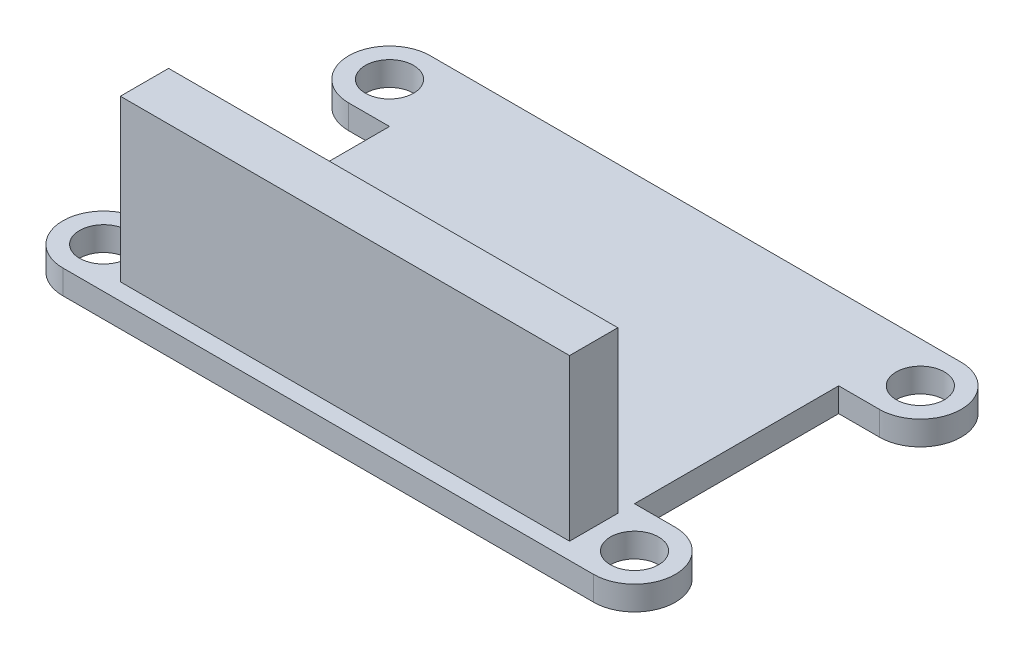
ISO-10303-21;
HEADER;
FILE_DESCRIPTION(('STEP AP214'),'2;1');
FILE_NAME('part.step','',(''),(''),'','','');
FILE_SCHEMA(('AUTOMOTIVE_DESIGN { 1 0 10303 214 1 1 1 1 }'));
ENDSEC;
DATA;
#1=APPLICATION_CONTEXT('core data for automotive mechanical design processes');
#2=APPLICATION_PROTOCOL_DEFINITION('international standard','automotive_design',2000,#1);
#3=PRODUCT_CONTEXT('',#1,'mechanical');
#4=PRODUCT('Part','Part','',(#3));
#5=PRODUCT_RELATED_PRODUCT_CATEGORY('part','',(#4));
#6=PRODUCT_DEFINITION_FORMATION('','',#4);
#7=PRODUCT_DEFINITION_CONTEXT('part definition',#1,'design');
#8=PRODUCT_DEFINITION('design','',#6,#7);
#9=PRODUCT_DEFINITION_SHAPE('','',#8);
#10=(LENGTH_UNIT() NAMED_UNIT(*) SI_UNIT(.MILLI.,.METRE.));
#11=(NAMED_UNIT(*) PLANE_ANGLE_UNIT() SI_UNIT($,.RADIAN.));
#12=(NAMED_UNIT(*) SI_UNIT($,.STERADIAN.) SOLID_ANGLE_UNIT());
#13=UNCERTAINTY_MEASURE_WITH_UNIT(LENGTH_MEASURE(1.E-05),#10,'distance_accuracy_value','');
#14=(GEOMETRIC_REPRESENTATION_CONTEXT(3) GLOBAL_UNCERTAINTY_ASSIGNED_CONTEXT((#13)) GLOBAL_UNIT_ASSIGNED_CONTEXT((#10,
#11,#12)) REPRESENTATION_CONTEXT('',''));
#15=CARTESIAN_POINT('',(0.,0.,0.));
#16=DIRECTION('',(0.,0.,1.));
#17=DIRECTION('',(1.,0.,0.));
#18=AXIS2_PLACEMENT_3D('',#15,#16,#17);
#19=CARTESIAN_POINT('',(35.56,1.5,-20.32));
#20=DIRECTION('',(0.,-1.,0.));
#21=DIRECTION('',(0.,0.,-1.));
#22=AXIS2_PLACEMENT_3D('',#19,#20,#21);
#23=CYLINDRICAL_SURFACE('',#22,2.53999999999999);
#24=CARTESIAN_POINT('',(35.56,0.,-20.32));
#25=DIRECTION('',(0.,1.,0.));
#26=DIRECTION('',(0.,0.,1.));
#27=AXIS2_PLACEMENT_3D('',#24,#25,#26);
#28=CIRCLE('',#27,2.53999999999999);
#29=CARTESIAN_POINT('',(35.56,0.,-22.86));
#30=VERTEX_POINT('',#29);
#31=CARTESIAN_POINT('',(35.56,0.,-17.78));
#32=VERTEX_POINT('',#31);
#33=EDGE_CURVE('E180',#30,#32,#28,.F.);
#34=ORIENTED_EDGE('',*,*,#33,.F.);
#35=DIRECTION('',(0.,-1.,0.));
#36=VECTOR('',#35,1.);
#37=CARTESIAN_POINT('',(35.56,1.5,-22.86));
#38=LINE('',#37,#36);
#39=CARTESIAN_POINT('',(35.56,1.5,-22.86));
#40=VERTEX_POINT('',#39);
#41=EDGE_CURVE('E11',#40,#30,#38,.T.);
#42=ORIENTED_EDGE('',*,*,#41,.F.);
#43=CARTESIAN_POINT('',(35.56,1.5,-20.32));
#44=DIRECTION('',(0.,1.,0.));
#45=DIRECTION('',(0.,0.,1.));
#46=AXIS2_PLACEMENT_3D('',#43,#44,#45);
#47=CIRCLE('',#46,2.53999999999999);
#48=CARTESIAN_POINT('',(35.56,1.5,-17.78));
#49=VERTEX_POINT('',#48);
#50=EDGE_CURVE('E378',#40,#49,#47,.F.);
#51=ORIENTED_EDGE('',*,*,#50,.T.);
#52=DIRECTION('',(0.,-1.,0.));
#53=VECTOR('',#52,1.);
#54=CARTESIAN_POINT('',(35.56,1.5,-17.78));
#55=LINE('',#54,#53);
#56=EDGE_CURVE('E60',#49,#32,#55,.T.);
#57=ORIENTED_EDGE('',*,*,#56,.T.);
#58=EDGE_LOOP('',(#34,#42,#51,#57));
#59=FACE_BOUND('',#58,.T.);
#60=ADVANCED_FACE('F36',(#59),#23,.T.);
#61=CARTESIAN_POINT('',(0.,1.5,-22.86));
#62=DIRECTION('',(0.,0.,1.));
#63=DIRECTION('',(1.,0.,0.));
#64=AXIS2_PLACEMENT_3D('',#61,#62,#63);
#65=PLANE('',#64);
#66=DIRECTION('',(-1.,0.,0.));
#67=VECTOR('',#66,1.);
#68=CARTESIAN_POINT('',(0.,0.,-22.86));
#69=LINE('',#68,#67);
#70=CARTESIAN_POINT('',(2.54000000000001,0.,-22.86));
#71=VERTEX_POINT('',#70);
#72=EDGE_CURVE('E183',#30,#71,#69,.T.);
#73=ORIENTED_EDGE('',*,*,#72,.T.);
#74=DIRECTION('',(0.,-1.,0.));
#75=VECTOR('',#74,1.);
#76=CARTESIAN_POINT('',(2.54000000000001,1.5,-22.86));
#77=LINE('',#76,#75);
#78=CARTESIAN_POINT('',(2.54000000000001,1.5,-22.86));
#79=VERTEX_POINT('',#78);
#80=EDGE_CURVE('E44',#79,#71,#77,.T.);
#81=ORIENTED_EDGE('',*,*,#80,.F.);
#82=DIRECTION('',(-1.,0.,0.));
#83=VECTOR('',#82,1.);
#84=CARTESIAN_POINT('',(0.,1.5,-22.86));
#85=LINE('',#84,#83);
#86=EDGE_CURVE('E380',#40,#79,#85,.T.);
#87=ORIENTED_EDGE('',*,*,#86,.F.);
#88=ORIENTED_EDGE('',*,*,#41,.T.);
#89=EDGE_LOOP('',(#73,#81,#87,#88));
#90=FACE_BOUND('',#89,.T.);
#91=ADVANCED_FACE('F250',(#90),#65,.F.);
#92=CARTESIAN_POINT('',(2.54000000000001,1.5,-20.32));
#93=DIRECTION('',(0.,-1.,0.));
#94=DIRECTION('',(0.,0.,-1.));
#95=AXIS2_PLACEMENT_3D('',#92,#93,#94);
#96=CYLINDRICAL_SURFACE('',#95,2.53999999999999);
#97=CARTESIAN_POINT('',(2.54000000000001,0.,-20.32));
#98=DIRECTION('',(0.,1.,0.));
#99=DIRECTION('',(0.,0.,1.));
#100=AXIS2_PLACEMENT_3D('',#97,#98,#99);
#101=CIRCLE('',#100,2.53999999999999);
#102=CARTESIAN_POINT('',(2.54000000000001,0.,-17.78));
#103=VERTEX_POINT('',#102);
#104=EDGE_CURVE('E186',#71,#103,#101,.T.);
#105=ORIENTED_EDGE('',*,*,#104,.T.);
#106=DIRECTION('',(0.,-1.,0.));
#107=VECTOR('',#106,1.);
#108=CARTESIAN_POINT('',(2.54000000000001,1.5,-17.78));
#109=LINE('',#108,#107);
#110=CARTESIAN_POINT('',(2.54000000000001,1.5,-17.78));
#111=VERTEX_POINT('',#110);
#112=EDGE_CURVE('E238',#111,#103,#109,.T.);
#113=ORIENTED_EDGE('',*,*,#112,.F.);
#114=CARTESIAN_POINT('',(2.54000000000001,1.5,-20.32));
#115=DIRECTION('',(0.,1.,0.));
#116=DIRECTION('',(0.,0.,1.));
#117=AXIS2_PLACEMENT_3D('',#114,#115,#116);
#118=CIRCLE('',#117,2.53999999999999);
#119=EDGE_CURVE('E246',#79,#111,#118,.T.);
#120=ORIENTED_EDGE('',*,*,#119,.F.);
#121=ORIENTED_EDGE('',*,*,#80,.T.);
#122=EDGE_LOOP('',(#105,#113,#120,#121));
#123=FACE_BOUND('',#122,.T.);
#124=ADVANCED_FACE('F243',(#123),#96,.T.);
#125=CARTESIAN_POINT('',(0.,1.5,-17.78));
#126=DIRECTION('',(0.,0.,-1.));
#127=DIRECTION('',(-1.,0.,0.));
#128=AXIS2_PLACEMENT_3D('',#125,#126,#127);
#129=PLANE('',#128);
#130=DIRECTION('',(1.,0.,0.));
#131=VECTOR('',#130,1.);
#132=CARTESIAN_POINT('',(0.,0.,-17.78));
#133=LINE('',#132,#131);
#134=CARTESIAN_POINT('',(5.08,0.,-17.78));
#135=VERTEX_POINT('',#134);
#136=EDGE_CURVE('E189',#103,#135,#133,.T.);
#137=ORIENTED_EDGE('',*,*,#136,.T.);
#138=DIRECTION('',(0.,-1.,0.));
#139=VECTOR('',#138,1.);
#140=CARTESIAN_POINT('',(5.08,1.5,-17.78));
#141=LINE('',#140,#139);
#142=CARTESIAN_POINT('',(5.08,1.5,-17.78));
#143=VERTEX_POINT('',#142);
#144=EDGE_CURVE('E235',#143,#135,#141,.T.);
#145=ORIENTED_EDGE('',*,*,#144,.F.);
#146=DIRECTION('',(1.,0.,0.));
#147=VECTOR('',#146,1.);
#148=CARTESIAN_POINT('',(0.,1.5,-17.78));
#149=LINE('',#148,#147);
#150=EDGE_CURVE('E383',#111,#143,#149,.T.);
#151=ORIENTED_EDGE('',*,*,#150,.F.);
#152=ORIENTED_EDGE('',*,*,#112,.T.);
#153=EDGE_LOOP('',(#137,#145,#151,#152));
#154=FACE_BOUND('',#153,.T.);
#155=ADVANCED_FACE('F262',(#154),#129,.F.);
#156=CARTESIAN_POINT('',(5.08000000000001,1.5,0.));
#157=DIRECTION('',(1.,0.,0.));
#158=DIRECTION('',(0.,0.,-1.));
#159=AXIS2_PLACEMENT_3D('',#156,#157,#158);
#160=PLANE('',#159);
#161=DIRECTION('',(0.,0.,1.));
#162=VECTOR('',#161,1.);
#163=CARTESIAN_POINT('',(5.08000000000001,0.,0.));
#164=LINE('',#163,#162);
#165=CARTESIAN_POINT('',(5.08000000000001,0.,-5.08));
#166=VERTEX_POINT('',#165);
#167=EDGE_CURVE('E192',#135,#166,#164,.T.);
#168=ORIENTED_EDGE('',*,*,#167,.T.);
#169=DIRECTION('',(0.,-1.,0.));
#170=VECTOR('',#169,1.);
#171=CARTESIAN_POINT('',(5.08000000000001,1.5,-5.08));
#172=LINE('',#171,#170);
#173=CARTESIAN_POINT('',(5.08000000000001,1.5,-5.08));
#174=VERTEX_POINT('',#173);
#175=EDGE_CURVE('E233',#174,#166,#172,.T.);
#176=ORIENTED_EDGE('',*,*,#175,.F.);
#177=DIRECTION('',(0.,0.,1.));
#178=VECTOR('',#177,1.);
#179=CARTESIAN_POINT('',(5.08000000000001,1.5,0.));
#180=LINE('',#179,#178);
#181=EDGE_CURVE('E386',#143,#174,#180,.T.);
#182=ORIENTED_EDGE('',*,*,#181,.F.);
#183=ORIENTED_EDGE('',*,*,#144,.T.);
#184=EDGE_LOOP('',(#168,#176,#182,#183));
#185=FACE_BOUND('',#184,.T.);
#186=ADVANCED_FACE('F265',(#185),#160,.F.);
#187=CARTESIAN_POINT('',(0.,1.5,-5.08));
#188=DIRECTION('',(0.,0.,-1.));
#189=DIRECTION('',(-1.,0.,0.));
#190=AXIS2_PLACEMENT_3D('',#187,#188,#189);
#191=PLANE('',#190);
#192=DIRECTION('',(1.,0.,0.));
#193=VECTOR('',#192,1.);
#194=CARTESIAN_POINT('',(0.,0.,-5.08));
#195=LINE('',#194,#193);
#196=CARTESIAN_POINT('',(2.54000000000001,0.,-5.08));
#197=VERTEX_POINT('',#196);
#198=EDGE_CURVE('E195',#197,#166,#195,.T.);
#199=ORIENTED_EDGE('',*,*,#198,.F.);
#200=DIRECTION('',(0.,-1.,0.));
#201=VECTOR('',#200,1.);
#202=CARTESIAN_POINT('',(2.54000000000001,1.5,-5.08));
#203=LINE('',#202,#201);
#204=CARTESIAN_POINT('',(2.54000000000001,1.5,-5.08));
#205=VERTEX_POINT('',#204);
#206=EDGE_CURVE('E231',#205,#197,#203,.T.);
#207=ORIENTED_EDGE('',*,*,#206,.F.);
#208=DIRECTION('',(1.,0.,0.));
#209=VECTOR('',#208,1.);
#210=CARTESIAN_POINT('',(0.,1.5,-5.08));
#211=LINE('',#210,#209);
#212=EDGE_CURVE('E388',#205,#174,#211,.T.);
#213=ORIENTED_EDGE('',*,*,#212,.T.);
#214=ORIENTED_EDGE('',*,*,#175,.T.);
#215=EDGE_LOOP('',(#199,#207,#213,#214));
#216=FACE_BOUND('',#215,.T.);
#217=ADVANCED_FACE('F269',(#216),#191,.T.);
#218=CARTESIAN_POINT('',(2.54000000000001,1.5,-2.54));
#219=DIRECTION('',(0.,-1.,0.));
#220=DIRECTION('',(0.,0.,-1.));
#221=AXIS2_PLACEMENT_3D('',#218,#219,#220);
#222=CYLINDRICAL_SURFACE('',#221,2.54);
#223=CARTESIAN_POINT('',(2.54000000000001,0.,-2.54));
#224=DIRECTION('',(0.,1.,0.));
#225=DIRECTION('',(0.,0.,1.));
#226=AXIS2_PLACEMENT_3D('',#223,#224,#225);
#227=CIRCLE('',#226,2.54);
#228=CARTESIAN_POINT('',(2.54000000000001,0.,0.));
#229=VERTEX_POINT('',#228);
#230=EDGE_CURVE('E198',#197,#229,#227,.T.);
#231=ORIENTED_EDGE('',*,*,#230,.T.);
#232=DIRECTION('',(0.,-1.,0.));
#233=VECTOR('',#232,1.);
#234=CARTESIAN_POINT('',(2.54000000000001,1.5,0.));
#235=LINE('',#234,#233);
#236=CARTESIAN_POINT('',(2.54000000000001,1.5,0.));
#237=VERTEX_POINT('',#236);
#238=EDGE_CURVE('E228',#237,#229,#235,.T.);
#239=ORIENTED_EDGE('',*,*,#238,.F.);
#240=CARTESIAN_POINT('',(2.54000000000001,1.5,-2.54));
#241=DIRECTION('',(0.,1.,0.));
#242=DIRECTION('',(0.,0.,1.));
#243=AXIS2_PLACEMENT_3D('',#240,#241,#242);
#244=CIRCLE('',#243,2.54);
#245=EDGE_CURVE('E391',#205,#237,#244,.T.);
#246=ORIENTED_EDGE('',*,*,#245,.F.);
#247=ORIENTED_EDGE('',*,*,#206,.T.);
#248=EDGE_LOOP('',(#231,#239,#246,#247));
#249=FACE_BOUND('',#248,.T.);
#250=ADVANCED_FACE('F273',(#249),#222,.T.);
#251=CARTESIAN_POINT('',(0.,1.5,0.));
#252=DIRECTION('',(0.,0.,-1.));
#253=DIRECTION('',(-1.,0.,0.));
#254=AXIS2_PLACEMENT_3D('',#251,#252,#253);
#255=PLANE('',#254);
#256=DIRECTION('',(1.,0.,0.));
#257=VECTOR('',#256,1.);
#258=CARTESIAN_POINT('',(0.,0.,0.));
#259=LINE('',#258,#257);
#260=CARTESIAN_POINT('',(35.56,0.,0.));
#261=VERTEX_POINT('',#260);
#262=EDGE_CURVE('E201',#229,#261,#259,.T.);
#263=ORIENTED_EDGE('',*,*,#262,.T.);
#264=DIRECTION('',(0.,-1.,0.));
#265=VECTOR('',#264,1.);
#266=CARTESIAN_POINT('',(35.56,1.5,0.));
#267=LINE('',#266,#265);
#268=CARTESIAN_POINT('',(35.56,1.5,0.));
#269=VERTEX_POINT('',#268);
#270=EDGE_CURVE('E226',#269,#261,#267,.T.);
#271=ORIENTED_EDGE('',*,*,#270,.F.);
#272=DIRECTION('',(1.,0.,0.));
#273=VECTOR('',#272,1.);
#274=CARTESIAN_POINT('',(0.,1.5,0.));
#275=LINE('',#274,#273);
#276=EDGE_CURVE('E394',#237,#269,#275,.T.);
#277=ORIENTED_EDGE('',*,*,#276,.F.);
#278=ORIENTED_EDGE('',*,*,#238,.T.);
#279=EDGE_LOOP('',(#263,#271,#277,#278));
#280=FACE_BOUND('',#279,.T.);
#281=ADVANCED_FACE('F277',(#280),#255,.F.);
#282=CARTESIAN_POINT('',(35.56,1.5,-2.54));
#283=DIRECTION('',(0.,-1.,0.));
#284=DIRECTION('',(0.,0.,-1.));
#285=AXIS2_PLACEMENT_3D('',#282,#283,#284);
#286=CYLINDRICAL_SURFACE('',#285,2.54);
#287=CARTESIAN_POINT('',(35.56,0.,-2.54));
#288=DIRECTION('',(0.,1.,0.));
#289=DIRECTION('',(0.,0.,1.));
#290=AXIS2_PLACEMENT_3D('',#287,#288,#289);
#291=CIRCLE('',#290,2.54);
#292=CARTESIAN_POINT('',(35.56,0.,-5.08));
#293=VERTEX_POINT('',#292);
#294=EDGE_CURVE('E204',#293,#261,#291,.F.);
#295=ORIENTED_EDGE('',*,*,#294,.F.);
#296=DIRECTION('',(0.,-1.,0.));
#297=VECTOR('',#296,1.);
#298=CARTESIAN_POINT('',(35.56,1.5,-5.08));
#299=LINE('',#298,#297);
#300=CARTESIAN_POINT('',(35.56,1.5,-5.08));
#301=VERTEX_POINT('',#300);
#302=EDGE_CURVE('E159',#301,#293,#299,.T.);
#303=ORIENTED_EDGE('',*,*,#302,.F.);
#304=CARTESIAN_POINT('',(35.56,1.5,-2.54));
#305=DIRECTION('',(0.,1.,0.));
#306=DIRECTION('',(0.,0.,1.));
#307=AXIS2_PLACEMENT_3D('',#304,#305,#306);
#308=CIRCLE('',#307,2.54);
#309=EDGE_CURVE('E148',#301,#269,#308,.F.);
#310=ORIENTED_EDGE('',*,*,#309,.T.);
#311=ORIENTED_EDGE('',*,*,#270,.T.);
#312=EDGE_LOOP('',(#295,#303,#310,#311));
#313=FACE_BOUND('',#312,.T.);
#314=ADVANCED_FACE('F281',(#313),#286,.T.);
#315=CARTESIAN_POINT('',(0.,1.5,-5.08));
#316=DIRECTION('',(0.,0.,1.));
#317=DIRECTION('',(1.,0.,0.));
#318=AXIS2_PLACEMENT_3D('',#315,#316,#317);
#319=PLANE('',#318);
#320=DIRECTION('',(-1.,0.,0.));
#321=VECTOR('',#320,1.);
#322=CARTESIAN_POINT('',(0.,0.,-5.08));
#323=LINE('',#322,#321);
#324=CARTESIAN_POINT('',(33.02,0.,-5.08));
#325=VERTEX_POINT('',#324);
#326=EDGE_CURVE('E155',#293,#325,#323,.T.);
#327=ORIENTED_EDGE('',*,*,#326,.T.);
#328=DIRECTION('',(0.,-1.,0.));
#329=VECTOR('',#328,1.);
#330=CARTESIAN_POINT('',(33.02,1.5,-5.08));
#331=LINE('',#330,#329);
#332=CARTESIAN_POINT('',(33.02,1.5,-5.08));
#333=VERTEX_POINT('',#332);
#334=EDGE_CURVE('E152',#333,#325,#331,.T.);
#335=ORIENTED_EDGE('',*,*,#334,.F.);
#336=DIRECTION('',(-1.,0.,0.));
#337=VECTOR('',#336,1.);
#338=CARTESIAN_POINT('',(0.,1.5,-5.08));
#339=LINE('',#338,#337);
#340=EDGE_CURVE('E139',#301,#333,#339,.T.);
#341=ORIENTED_EDGE('',*,*,#340,.F.);
#342=ORIENTED_EDGE('',*,*,#302,.T.);
#343=EDGE_LOOP('',(#327,#335,#341,#342));
#344=FACE_BOUND('',#343,.T.);
#345=ADVANCED_FACE('F153',(#344),#319,.F.);
#346=CARTESIAN_POINT('',(33.02,1.5,0.));
#347=DIRECTION('',(1.,0.,0.));
#348=DIRECTION('',(0.,0.,-1.));
#349=AXIS2_PLACEMENT_3D('',#346,#347,#348);
#350=PLANE('',#349);
#351=DIRECTION('',(0.,0.,1.));
#352=VECTOR('',#351,1.);
#353=CARTESIAN_POINT('',(33.02,0.,0.));
#354=LINE('',#353,#352);
#355=CARTESIAN_POINT('',(33.02,0.,-17.78));
#356=VERTEX_POINT('',#355);
#357=EDGE_CURVE('E208',#356,#325,#354,.T.);
#358=ORIENTED_EDGE('',*,*,#357,.F.);
#359=DIRECTION('',(0.,-1.,0.));
#360=VECTOR('',#359,1.);
#361=CARTESIAN_POINT('',(33.02,1.5,-17.78));
#362=LINE('',#361,#360);
#363=CARTESIAN_POINT('',(33.02,1.5,-17.78));
#364=VERTEX_POINT('',#363);
#365=EDGE_CURVE('E160',#364,#356,#362,.T.);
#366=ORIENTED_EDGE('',*,*,#365,.F.);
#367=DIRECTION('',(0.,0.,1.));
#368=VECTOR('',#367,1.);
#369=CARTESIAN_POINT('',(33.02,1.5,0.));
#370=LINE('',#369,#368);
#371=EDGE_CURVE('E146',#364,#333,#370,.T.);
#372=ORIENTED_EDGE('',*,*,#371,.T.);
#373=ORIENTED_EDGE('',*,*,#334,.T.);
#374=EDGE_LOOP('',(#358,#366,#372,#373));
#375=FACE_BOUND('',#374,.T.);
#376=ADVANCED_FACE('F162',(#375),#350,.T.);
#377=CARTESIAN_POINT('',(2.54000000000001,1.5,-20.32));
#378=DIRECTION('',(0.,-1.,0.));
#379=DIRECTION('',(0.,0.,-1.));
#380=AXIS2_PLACEMENT_3D('',#377,#378,#379);
#381=CYLINDRICAL_SURFACE('',#380,1.5);
#382=CARTESIAN_POINT('',(2.54000000000001,1.5,-20.32));
#383=DIRECTION('',(0.,1.,0.));
#384=DIRECTION('',(0.,0.,1.));
#385=AXIS2_PLACEMENT_3D('',#382,#383,#384);
#386=CIRCLE('',#385,1.5);
#387=CARTESIAN_POINT('',(2.54000000000001,1.5,-18.82));
#388=VERTEX_POINT('',#387);
#389=EDGE_CURVE('E171',#388,#388,#386,.T.);
#390=ORIENTED_EDGE('',*,*,#389,.T.);
#391=EDGE_LOOP('',(#390));
#392=FACE_BOUND('',#391,.T.);
#393=CARTESIAN_POINT('',(2.54000000000001,0.,-20.32));
#394=DIRECTION('',(0.,1.,0.));
#395=DIRECTION('',(0.,0.,1.));
#396=AXIS2_PLACEMENT_3D('',#393,#394,#395);
#397=CIRCLE('',#396,1.5);
#398=CARTESIAN_POINT('',(2.54000000000001,0.,-18.82));
#399=VERTEX_POINT('',#398);
#400=EDGE_CURVE('E216',#399,#399,#397,.T.);
#401=ORIENTED_EDGE('',*,*,#400,.F.);
#402=EDGE_LOOP('',(#401));
#403=FACE_BOUND('',#402,.T.);
#404=ADVANCED_FACE('F290',(#392,#403),#381,.F.);
#405=CARTESIAN_POINT('',(2.54000000000001,1.5,-2.54));
#406=DIRECTION('',(0.,-1.,0.));
#407=DIRECTION('',(0.,0.,-1.));
#408=AXIS2_PLACEMENT_3D('',#405,#406,#407);
#409=CYLINDRICAL_SURFACE('',#408,1.5);
#410=CARTESIAN_POINT('',(2.54000000000001,1.5,-2.54));
#411=DIRECTION('',(0.,1.,0.));
#412=DIRECTION('',(0.,0.,1.));
#413=AXIS2_PLACEMENT_3D('',#410,#411,#412);
#414=CIRCLE('',#413,1.5);
#415=CARTESIAN_POINT('',(2.54000000000001,1.5,-1.04));
#416=VERTEX_POINT('',#415);
#417=EDGE_CURVE('E165',#416,#416,#414,.T.);
#418=ORIENTED_EDGE('',*,*,#417,.T.);
#419=EDGE_LOOP('',(#418));
#420=FACE_BOUND('',#419,.T.);
#421=CARTESIAN_POINT('',(2.54000000000001,0.,-2.54));
#422=DIRECTION('',(0.,1.,0.));
#423=DIRECTION('',(0.,0.,1.));
#424=AXIS2_PLACEMENT_3D('',#421,#422,#423);
#425=CIRCLE('',#424,1.5);
#426=CARTESIAN_POINT('',(2.54000000000001,0.,-1.04));
#427=VERTEX_POINT('',#426);
#428=EDGE_CURVE('E213',#427,#427,#425,.T.);
#429=ORIENTED_EDGE('',*,*,#428,.F.);
#430=EDGE_LOOP('',(#429));
#431=FACE_BOUND('',#430,.T.);
#432=ADVANCED_FACE('F294',(#420,#431),#409,.F.);
#433=CARTESIAN_POINT('',(0.,1.5,-17.78));
#434=DIRECTION('',(0.,0.,1.));
#435=DIRECTION('',(1.,0.,0.));
#436=AXIS2_PLACEMENT_3D('',#433,#434,#435);
#437=PLANE('',#436);
#438=DIRECTION('',(-1.,0.,0.));
#439=VECTOR('',#438,1.);
#440=CARTESIAN_POINT('',(0.,0.,-17.78));
#441=LINE('',#440,#439);
#442=EDGE_CURVE('E210',#32,#356,#441,.T.);
#443=ORIENTED_EDGE('',*,*,#442,.F.);
#444=ORIENTED_EDGE('',*,*,#56,.F.);
#445=DIRECTION('',(-1.,0.,0.));
#446=VECTOR('',#445,1.);
#447=CARTESIAN_POINT('',(0.,1.5,-17.78));
#448=LINE('',#447,#446);
#449=EDGE_CURVE('E163',#49,#364,#448,.T.);
#450=ORIENTED_EDGE('',*,*,#449,.T.);
#451=ORIENTED_EDGE('',*,*,#365,.T.);
#452=EDGE_LOOP('',(#443,#444,#450,#451));
#453=FACE_BOUND('',#452,.T.);
#454=ADVANCED_FACE('F291',(#453),#437,.T.);
#455=CARTESIAN_POINT('',(35.56,1.5,-2.54));
#456=DIRECTION('',(0.,-1.,0.));
#457=DIRECTION('',(0.,0.,-1.));
#458=AXIS2_PLACEMENT_3D('',#455,#456,#457);
#459=CYLINDRICAL_SURFACE('',#458,1.5);
#460=CARTESIAN_POINT('',(35.56,1.5,-2.54));
#461=DIRECTION('',(0.,1.,0.));
#462=DIRECTION('',(0.,0.,1.));
#463=AXIS2_PLACEMENT_3D('',#460,#461,#462);
#464=CIRCLE('',#463,1.5);
#465=CARTESIAN_POINT('',(35.56,1.5,-1.04));
#466=VERTEX_POINT('',#465);
#467=EDGE_CURVE('E222',#466,#466,#464,.F.);
#468=ORIENTED_EDGE('',*,*,#467,.F.);
#469=EDGE_LOOP('',(#468));
#470=FACE_BOUND('',#469,.T.);
#471=CARTESIAN_POINT('',(35.56,0.,-2.54));
#472=DIRECTION('',(0.,1.,0.));
#473=DIRECTION('',(0.,0.,1.));
#474=AXIS2_PLACEMENT_3D('',#471,#472,#473);
#475=CIRCLE('',#474,1.5);
#476=CARTESIAN_POINT('',(35.56,0.,-1.04));
#477=VERTEX_POINT('',#476);
#478=EDGE_CURVE('E177',#477,#477,#475,.F.);
#479=ORIENTED_EDGE('',*,*,#478,.T.);
#480=EDGE_LOOP('',(#479));
#481=FACE_BOUND('',#480,.T.);
#482=ADVANCED_FACE('F38',(#470,#481),#459,.F.);
#483=CARTESIAN_POINT('',(35.56,1.5,-20.32));
#484=DIRECTION('',(0.,-1.,0.));
#485=DIRECTION('',(0.,0.,-1.));
#486=AXIS2_PLACEMENT_3D('',#483,#484,#485);
#487=CYLINDRICAL_SURFACE('',#486,1.5);
#488=CARTESIAN_POINT('',(35.56,1.5,-20.32));
#489=DIRECTION('',(0.,1.,0.));
#490=DIRECTION('',(0.,0.,1.));
#491=AXIS2_PLACEMENT_3D('',#488,#489,#490);
#492=CIRCLE('',#491,1.5);
#493=CARTESIAN_POINT('',(35.56,1.5,-18.82));
#494=VERTEX_POINT('',#493);
#495=EDGE_CURVE('E174',#494,#494,#492,.F.);
#496=ORIENTED_EDGE('',*,*,#495,.F.);
#497=EDGE_LOOP('',(#496));
#498=FACE_BOUND('',#497,.T.);
#499=CARTESIAN_POINT('',(35.56,0.,-20.32));
#500=DIRECTION('',(0.,1.,0.));
#501=DIRECTION('',(0.,0.,1.));
#502=AXIS2_PLACEMENT_3D('',#499,#500,#501);
#503=CIRCLE('',#502,1.5);
#504=CARTESIAN_POINT('',(35.56,0.,-18.82));
#505=VERTEX_POINT('',#504);
#506=EDGE_CURVE('E219',#505,#505,#503,.F.);
#507=ORIENTED_EDGE('',*,*,#506,.T.);
#508=EDGE_LOOP('',(#507));
#509=FACE_BOUND('',#508,.T.);
#510=ADVANCED_FACE('F301',(#498,#509),#487,.F.);
#511=CARTESIAN_POINT('',(0.,1.5,0.));
#512=DIRECTION('',(0.,1.,0.));
#513=DIRECTION('',(0.,0.,1.));
#514=AXIS2_PLACEMENT_3D('',#511,#512,#513);
#515=PLANE('',#514);
#516=DIRECTION('',(-1.,0.,0.));
#517=VECTOR('',#516,1.);
#518=CARTESIAN_POINT('',(0.,1.5,-1.04));
#519=LINE('',#518,#517);
#520=CARTESIAN_POINT('',(33.02,1.5,-1.04));
#521=VERTEX_POINT('',#520);
#522=CARTESIAN_POINT('',(5.08000000000001,1.5,-1.04));
#523=VERTEX_POINT('',#522);
#524=EDGE_CURVE('E362',#521,#523,#519,.T.);
#525=ORIENTED_EDGE('',*,*,#524,.T.);
#526=DIRECTION('',(0.,0.,1.));
#527=VECTOR('',#526,1.);
#528=CARTESIAN_POINT('',(5.08000000000001,1.5,0.));
#529=LINE('',#528,#527);
#530=CARTESIAN_POINT('',(5.08000000000001,1.5,-4.04));
#531=VERTEX_POINT('',#530);
#532=EDGE_CURVE('E348',#531,#523,#529,.T.);
#533=ORIENTED_EDGE('',*,*,#532,.F.);
#534=DIRECTION('',(1.,0.,0.));
#535=VECTOR('',#534,1.);
#536=CARTESIAN_POINT('',(0.,1.5,-4.04));
#537=LINE('',#536,#535);
#538=CARTESIAN_POINT('',(33.02,1.5,-4.04));
#539=VERTEX_POINT('',#538);
#540=EDGE_CURVE('E51',#531,#539,#537,.T.);
#541=ORIENTED_EDGE('',*,*,#540,.T.);
#542=DIRECTION('',(0.,0.,1.));
#543=VECTOR('',#542,1.);
#544=CARTESIAN_POINT('',(33.02,1.5,0.));
#545=LINE('',#544,#543);
#546=EDGE_CURVE('E365',#539,#521,#545,.T.);
#547=ORIENTED_EDGE('',*,*,#546,.T.);
#548=EDGE_LOOP('',(#525,#533,#541,#547));
#549=FACE_BOUND('',#548,.T.);
#550=ORIENTED_EDGE('',*,*,#467,.T.);
#551=EDGE_LOOP('',(#550));
#552=FACE_BOUND('',#551,.T.);
#553=ORIENTED_EDGE('',*,*,#50,.F.);
#554=ORIENTED_EDGE('',*,*,#86,.T.);
#555=ORIENTED_EDGE('',*,*,#119,.T.);
#556=ORIENTED_EDGE('',*,*,#150,.T.);
#557=ORIENTED_EDGE('',*,*,#181,.T.);
#558=ORIENTED_EDGE('',*,*,#212,.F.);
#559=ORIENTED_EDGE('',*,*,#245,.T.);
#560=ORIENTED_EDGE('',*,*,#276,.T.);
#561=ORIENTED_EDGE('',*,*,#309,.F.);
#562=ORIENTED_EDGE('',*,*,#340,.T.);
#563=ORIENTED_EDGE('',*,*,#371,.F.);
#564=ORIENTED_EDGE('',*,*,#449,.F.);
#565=EDGE_LOOP('',(#553,#554,#555,#556,#557,#558,#559,#560,#561,#562,#563,#564));
#566=FACE_BOUND('',#565,.T.);
#567=ORIENTED_EDGE('',*,*,#417,.F.);
#568=EDGE_LOOP('',(#567));
#569=FACE_BOUND('',#568,.T.);
#570=ORIENTED_EDGE('',*,*,#389,.F.);
#571=EDGE_LOOP('',(#570));
#572=FACE_BOUND('',#571,.T.);
#573=ORIENTED_EDGE('',*,*,#495,.T.);
#574=EDGE_LOOP('',(#573));
#575=FACE_BOUND('',#574,.T.);
#576=ADVANCED_FACE('F142',(#549,#552,#566,#569,#572,#575),#515,.T.);
#577=CARTESIAN_POINT('',(0.,0.,0.));
#578=DIRECTION('',(0.,1.,0.));
#579=DIRECTION('',(0.,0.,1.));
#580=AXIS2_PLACEMENT_3D('',#577,#578,#579);
#581=PLANE('',#580);
#582=ORIENTED_EDGE('',*,*,#478,.F.);
#583=EDGE_LOOP('',(#582));
#584=FACE_BOUND('',#583,.T.);
#585=ORIENTED_EDGE('',*,*,#33,.T.);
#586=ORIENTED_EDGE('',*,*,#442,.T.);
#587=ORIENTED_EDGE('',*,*,#357,.T.);
#588=ORIENTED_EDGE('',*,*,#326,.F.);
#589=ORIENTED_EDGE('',*,*,#294,.T.);
#590=ORIENTED_EDGE('',*,*,#262,.F.);
#591=ORIENTED_EDGE('',*,*,#230,.F.);
#592=ORIENTED_EDGE('',*,*,#198,.T.);
#593=ORIENTED_EDGE('',*,*,#167,.F.);
#594=ORIENTED_EDGE('',*,*,#136,.F.);
#595=ORIENTED_EDGE('',*,*,#104,.F.);
#596=ORIENTED_EDGE('',*,*,#72,.F.);
#597=EDGE_LOOP('',(#585,#586,#587,#588,#589,#590,#591,#592,#593,#594,#595,#596));
#598=FACE_BOUND('',#597,.T.);
#599=ORIENTED_EDGE('',*,*,#428,.T.);
#600=EDGE_LOOP('',(#599));
#601=FACE_BOUND('',#600,.T.);
#602=ORIENTED_EDGE('',*,*,#400,.T.);
#603=EDGE_LOOP('',(#602));
#604=FACE_BOUND('',#603,.T.);
#605=ORIENTED_EDGE('',*,*,#506,.F.);
#606=EDGE_LOOP('',(#605));
#607=FACE_BOUND('',#606,.T.);
#608=ADVANCED_FACE('F252',(#584,#598,#601,#604,#607),#581,.F.);
#609=CARTESIAN_POINT('',(0.,11.5,-1.04));
#610=DIRECTION('',(0.,0.,1.));
#611=DIRECTION('',(1.,0.,0.));
#612=AXIS2_PLACEMENT_3D('',#609,#610,#611);
#613=PLANE('',#612);
#614=ORIENTED_EDGE('',*,*,#524,.F.);
#615=DIRECTION('',(0.,-1.,0.));
#616=VECTOR('',#615,1.);
#617=CARTESIAN_POINT('',(33.02,11.5,-1.04));
#618=LINE('',#617,#616);
#619=CARTESIAN_POINT('',(33.02,11.5,-1.04));
#620=VERTEX_POINT('',#619);
#621=EDGE_CURVE('E181',#620,#521,#618,.T.);
#622=ORIENTED_EDGE('',*,*,#621,.F.);
#623=DIRECTION('',(-1.,0.,0.));
#624=VECTOR('',#623,1.);
#625=CARTESIAN_POINT('',(0.,11.5,-1.04));
#626=LINE('',#625,#624);
#627=CARTESIAN_POINT('',(5.08000000000001,11.5,-1.04));
#628=VERTEX_POINT('',#627);
#629=EDGE_CURVE('E336',#620,#628,#626,.T.);
#630=ORIENTED_EDGE('',*,*,#629,.T.);
#631=DIRECTION('',(0.,-1.,0.));
#632=VECTOR('',#631,1.);
#633=CARTESIAN_POINT('',(5.08000000000001,11.5,-1.04));
#634=LINE('',#633,#632);
#635=EDGE_CURVE('E361',#628,#523,#634,.T.);
#636=ORIENTED_EDGE('',*,*,#635,.T.);
#637=EDGE_LOOP('',(#614,#622,#630,#636));
#638=FACE_BOUND('',#637,.T.);
#639=ADVANCED_FACE('F307',(#638),#613,.T.);
#640=CARTESIAN_POINT('',(33.02,11.5,0.));
#641=DIRECTION('',(1.,0.,0.));
#642=DIRECTION('',(0.,0.,-1.));
#643=AXIS2_PLACEMENT_3D('',#640,#641,#642);
#644=PLANE('',#643);
#645=ORIENTED_EDGE('',*,*,#546,.F.);
#646=DIRECTION('',(0.,-1.,0.));
#647=VECTOR('',#646,1.);
#648=CARTESIAN_POINT('',(33.02,11.5,-4.04));
#649=LINE('',#648,#647);
#650=CARTESIAN_POINT('',(33.02,11.5,-4.04));
#651=VERTEX_POINT('',#650);
#652=EDGE_CURVE('E355',#651,#539,#649,.T.);
#653=ORIENTED_EDGE('',*,*,#652,.F.);
#654=DIRECTION('',(0.,0.,1.));
#655=VECTOR('',#654,1.);
#656=CARTESIAN_POINT('',(33.02,11.5,0.));
#657=LINE('',#656,#655);
#658=EDGE_CURVE('E340',#651,#620,#657,.T.);
#659=ORIENTED_EDGE('',*,*,#658,.T.);
#660=ORIENTED_EDGE('',*,*,#621,.T.);
#661=EDGE_LOOP('',(#645,#653,#659,#660));
#662=FACE_BOUND('',#661,.T.);
#663=ADVANCED_FACE('F314',(#662),#644,.T.);
#664=CARTESIAN_POINT('',(0.,11.5,-4.04));
#665=DIRECTION('',(0.,0.,-1.));
#666=DIRECTION('',(-1.,0.,0.));
#667=AXIS2_PLACEMENT_3D('',#664,#665,#666);
#668=PLANE('',#667);
#669=ORIENTED_EDGE('',*,*,#540,.F.);
#670=DIRECTION('',(0.,-1.,0.));
#671=VECTOR('',#670,1.);
#672=CARTESIAN_POINT('',(5.08000000000001,11.5,-4.04));
#673=LINE('',#672,#671);
#674=CARTESIAN_POINT('',(5.08000000000001,11.5,-4.04));
#675=VERTEX_POINT('',#674);
#676=EDGE_CURVE('E372',#675,#531,#673,.T.);
#677=ORIENTED_EDGE('',*,*,#676,.F.);
#678=DIRECTION('',(1.,0.,0.));
#679=VECTOR('',#678,1.);
#680=CARTESIAN_POINT('',(0.,11.5,-4.04));
#681=LINE('',#680,#679);
#682=EDGE_CURVE('E356',#675,#651,#681,.T.);
#683=ORIENTED_EDGE('',*,*,#682,.T.);
#684=ORIENTED_EDGE('',*,*,#652,.T.);
#685=EDGE_LOOP('',(#669,#677,#683,#684));
#686=FACE_BOUND('',#685,.T.);
#687=ADVANCED_FACE('F318',(#686),#668,.T.);
#688=CARTESIAN_POINT('',(5.08000000000001,11.5,0.));
#689=DIRECTION('',(1.,0.,0.));
#690=DIRECTION('',(0.,0.,-1.));
#691=AXIS2_PLACEMENT_3D('',#688,#689,#690);
#692=PLANE('',#691);
#693=ORIENTED_EDGE('',*,*,#532,.T.);
#694=ORIENTED_EDGE('',*,*,#635,.F.);
#695=DIRECTION('',(0.,0.,1.));
#696=VECTOR('',#695,1.);
#697=CARTESIAN_POINT('',(5.08000000000001,11.5,0.));
#698=LINE('',#697,#696);
#699=EDGE_CURVE('E343',#675,#628,#698,.T.);
#700=ORIENTED_EDGE('',*,*,#699,.F.);
#701=ORIENTED_EDGE('',*,*,#676,.T.);
#702=EDGE_LOOP('',(#693,#694,#700,#701));
#703=FACE_BOUND('',#702,.T.);
#704=ADVANCED_FACE('F322',(#703),#692,.F.);
#705=CARTESIAN_POINT('',(0.,11.5,0.));
#706=DIRECTION('',(0.,1.,0.));
#707=DIRECTION('',(0.,0.,1.));
#708=AXIS2_PLACEMENT_3D('',#705,#706,#707);
#709=PLANE('',#708);
#710=ORIENTED_EDGE('',*,*,#629,.F.);
#711=ORIENTED_EDGE('',*,*,#658,.F.);
#712=ORIENTED_EDGE('',*,*,#682,.F.);
#713=ORIENTED_EDGE('',*,*,#699,.T.);
#714=EDGE_LOOP('',(#710,#711,#712,#713));
#715=FACE_BOUND('',#714,.T.);
#716=ADVANCED_FACE('F325',(#715),#709,.T.);
#717=CLOSED_SHELL('',(#60,#91,#124,#155,#186,#217,#250,#281,#314,#345,#376,#404,#432,#454,#482,
#510,#576,#608,#639,#663,#687,#704,#716));
#718=MANIFOLD_SOLID_BREP('B2',#717);
#719=ADVANCED_BREP_SHAPE_REPRESENTATION('',(#18,#718),#14);
#720=SHAPE_DEFINITION_REPRESENTATION(#9,#719);
ENDSEC;
END-ISO-10303-21;
